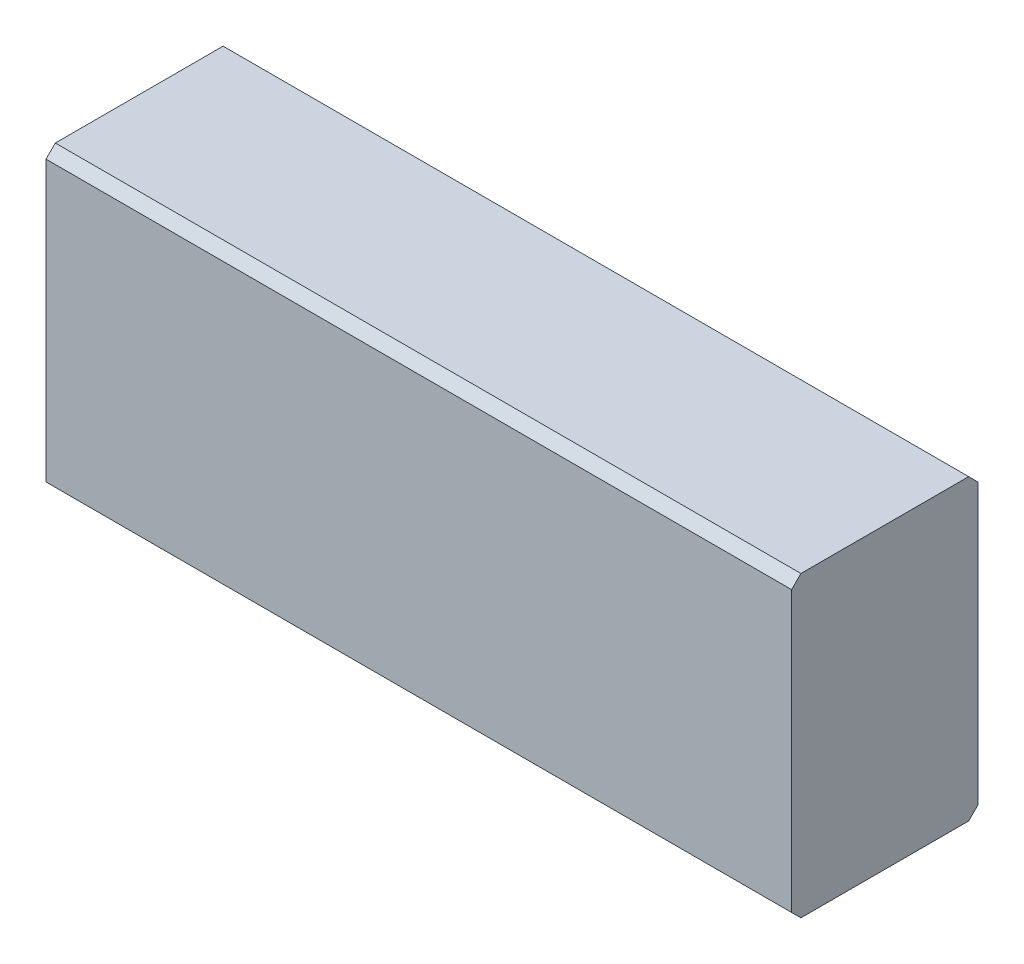
ISO-10303-21;
HEADER;
FILE_DESCRIPTION(('STEP AP214'),'2;1');
FILE_NAME('part.step','',(''),(''),'','','');
FILE_SCHEMA(('AUTOMOTIVE_DESIGN { 1 0 10303 214 1 1 1 1 }'));
ENDSEC;
DATA;
#1=APPLICATION_CONTEXT('core data for automotive mechanical design processes');
#2=APPLICATION_PROTOCOL_DEFINITION('international standard','automotive_design',2000,#1);
#3=PRODUCT_CONTEXT('',#1,'mechanical');
#4=PRODUCT('Part','Part','',(#3));
#5=PRODUCT_RELATED_PRODUCT_CATEGORY('part','',(#4));
#6=PRODUCT_DEFINITION_FORMATION('','',#4);
#7=PRODUCT_DEFINITION_CONTEXT('part definition',#1,'design');
#8=PRODUCT_DEFINITION('design','',#6,#7);
#9=PRODUCT_DEFINITION_SHAPE('','',#8);
#10=(LENGTH_UNIT() NAMED_UNIT(*) SI_UNIT(.MILLI.,.METRE.));
#11=(NAMED_UNIT(*) PLANE_ANGLE_UNIT() SI_UNIT($,.RADIAN.));
#12=(NAMED_UNIT(*) SI_UNIT($,.STERADIAN.) SOLID_ANGLE_UNIT());
#13=UNCERTAINTY_MEASURE_WITH_UNIT(LENGTH_MEASURE(1.E-05),#10,'distance_accuracy_value','');
#14=(GEOMETRIC_REPRESENTATION_CONTEXT(3) GLOBAL_UNCERTAINTY_ASSIGNED_CONTEXT((#13)) GLOBAL_UNIT_ASSIGNED_CONTEXT((#10,
#11,#12)) REPRESENTATION_CONTEXT('',''));
#15=CARTESIAN_POINT('',(0.,0.,0.));
#16=DIRECTION('',(0.,0.,1.));
#17=DIRECTION('',(1.,0.,0.));
#18=AXIS2_PLACEMENT_3D('',#15,#16,#17);
#19=CARTESIAN_POINT('',(4.,4.,5.));
#20=DIRECTION('',(-1.,0.,0.));
#21=DIRECTION('',(0.,-1.,0.));
#22=AXIS2_PLACEMENT_3D('',#19,#20,#21);
#23=PLANE('',#22);
#24=DIRECTION('',(0.,1.,0.));
#25=VECTOR('',#24,1.);
#26=CARTESIAN_POINT('',(4.,4.,0.));
#27=LINE('',#26,#25);
#28=CARTESIAN_POINT('',(4.,-3.75,0.));
#29=VERTEX_POINT('',#28);
#30=CARTESIAN_POINT('',(4.,3.75,0.));
#31=VERTEX_POINT('',#30);
#32=EDGE_CURVE('E191',#29,#31,#27,.T.);
#33=ORIENTED_EDGE('',*,*,#32,.T.);
#34=DIRECTION('',(0.,-0.707106781186548,-0.707106781186548));
#35=VECTOR('',#34,1.);
#36=CARTESIAN_POINT('',(4.,4.,0.25));
#37=LINE('',#36,#35);
#38=CARTESIAN_POINT('',(4.,4.,0.25));
#39=VERTEX_POINT('',#38);
#40=EDGE_CURVE('E171',#31,#39,#37,.F.);
#41=ORIENTED_EDGE('',*,*,#40,.T.);
#42=DIRECTION('',(0.,0.,-1.));
#43=VECTOR('',#42,1.);
#44=CARTESIAN_POINT('',(4.,4.,5.));
#45=LINE('',#44,#43);
#46=CARTESIAN_POINT('',(4.,4.,4.74999999999999));
#47=VERTEX_POINT('',#46);
#48=EDGE_CURVE('E135',#47,#39,#45,.T.);
#49=ORIENTED_EDGE('',*,*,#48,.F.);
#50=DIRECTION('',(0.,-0.707106781186543,0.707106781186552));
#51=VECTOR('',#50,1.);
#52=CARTESIAN_POINT('',(4.,3.75,5.));
#53=LINE('',#52,#51);
#54=CARTESIAN_POINT('',(4.,3.75,5.));
#55=VERTEX_POINT('',#54);
#56=EDGE_CURVE('E140',#47,#55,#53,.T.);
#57=ORIENTED_EDGE('',*,*,#56,.T.);
#58=DIRECTION('',(0.,1.,0.));
#59=VECTOR('',#58,1.);
#60=CARTESIAN_POINT('',(4.,4.,5.));
#61=LINE('',#60,#59);
#62=CARTESIAN_POINT('',(4.,-3.75,5.));
#63=VERTEX_POINT('',#62);
#64=EDGE_CURVE('E136',#63,#55,#61,.T.);
#65=ORIENTED_EDGE('',*,*,#64,.F.);
#66=DIRECTION('',(0.,-0.707106781186548,-0.707106781186548));
#67=VECTOR('',#66,1.);
#68=CARTESIAN_POINT('',(4.,-3.75,5.));
#69=LINE('',#68,#67);
#70=CARTESIAN_POINT('',(4.,-4.,4.75));
#71=VERTEX_POINT('',#70);
#72=EDGE_CURVE('E69',#63,#71,#69,.T.);
#73=ORIENTED_EDGE('',*,*,#72,.T.);
#74=DIRECTION('',(0.,0.,-1.));
#75=VECTOR('',#74,1.);
#76=CARTESIAN_POINT('',(4.,-4.,5.));
#77=LINE('',#76,#75);
#78=CARTESIAN_POINT('',(4.,-4.,0.25));
#79=VERTEX_POINT('',#78);
#80=EDGE_CURVE('E148',#71,#79,#77,.T.);
#81=ORIENTED_EDGE('',*,*,#80,.T.);
#82=DIRECTION('',(0.,-0.707106781186548,0.707106781186548));
#83=VECTOR('',#82,1.);
#84=CARTESIAN_POINT('',(4.,-4.,0.250000000000001));
#85=LINE('',#84,#83);
#86=EDGE_CURVE('E61',#79,#29,#85,.F.);
#87=ORIENTED_EDGE('',*,*,#86,.T.);
#88=EDGE_LOOP('',(#33,#41,#49,#57,#65,#73,#81,#87));
#89=FACE_BOUND('',#88,.T.);
#90=ADVANCED_FACE('F45',(#89),#23,.F.);
#91=CARTESIAN_POINT('',(0.,4.,5.));
#92=DIRECTION('',(0.,-1.,0.));
#93=DIRECTION('',(0.,0.,-1.));
#94=AXIS2_PLACEMENT_3D('',#91,#92,#93);
#95=PLANE('',#94);
#96=ORIENTED_EDGE('',*,*,#48,.T.);
#97=DIRECTION('',(-1.,0.,0.));
#98=VECTOR('',#97,1.);
#99=CARTESIAN_POINT('',(0.,4.,0.25));
#100=LINE('',#99,#98);
#101=CARTESIAN_POINT('',(-16.,4.,0.25));
#102=VERTEX_POINT('',#101);
#103=EDGE_CURVE('E133',#39,#102,#100,.T.);
#104=ORIENTED_EDGE('',*,*,#103,.T.);
#105=DIRECTION('',(0.,0.,-1.));
#106=VECTOR('',#105,1.);
#107=CARTESIAN_POINT('',(-16.,4.,5.));
#108=LINE('',#107,#106);
#109=CARTESIAN_POINT('',(-16.,4.,4.74999999999999));
#110=VERTEX_POINT('',#109);
#111=EDGE_CURVE('E116',#110,#102,#108,.T.);
#112=ORIENTED_EDGE('',*,*,#111,.F.);
#113=DIRECTION('',(1.,0.,0.));
#114=VECTOR('',#113,1.);
#115=CARTESIAN_POINT('',(4.,4.,4.74999999999999));
#116=LINE('',#115,#114);
#117=EDGE_CURVE('E130',#110,#47,#116,.T.);
#118=ORIENTED_EDGE('',*,*,#117,.T.);
#119=EDGE_LOOP('',(#96,#104,#112,#118));
#120=FACE_BOUND('',#119,.T.);
#121=ADVANCED_FACE('F129',(#120),#95,.F.);
#122=CARTESIAN_POINT('',(-12.,-4.,5.));
#123=DIRECTION('',(0.,1.,0.));
#124=DIRECTION('',(0.,0.,1.));
#125=AXIS2_PLACEMENT_3D('',#122,#123,#124);
#126=PLANE('',#125);
#127=DIRECTION('',(0.,0.,-1.));
#128=VECTOR('',#127,1.);
#129=CARTESIAN_POINT('',(-16.,-4.,5.));
#130=LINE('',#129,#128);
#131=CARTESIAN_POINT('',(-16.,-4.,4.75));
#132=VERTEX_POINT('',#131);
#133=CARTESIAN_POINT('',(-16.,-4.,0.25));
#134=VERTEX_POINT('',#133);
#135=EDGE_CURVE('E142',#132,#134,#130,.T.);
#136=ORIENTED_EDGE('',*,*,#135,.T.);
#137=DIRECTION('',(1.,0.,0.));
#138=VECTOR('',#137,1.);
#139=CARTESIAN_POINT('',(-12.,-4.,0.25));
#140=LINE('',#139,#138);
#141=EDGE_CURVE('E177',#134,#79,#140,.T.);
#142=ORIENTED_EDGE('',*,*,#141,.T.);
#143=ORIENTED_EDGE('',*,*,#80,.F.);
#144=DIRECTION('',(-1.,0.,0.));
#145=VECTOR('',#144,1.);
#146=CARTESIAN_POINT('',(-16.,-4.,4.75));
#147=LINE('',#146,#145);
#148=EDGE_CURVE('E174',#71,#132,#147,.T.);
#149=ORIENTED_EDGE('',*,*,#148,.T.);
#150=EDGE_LOOP('',(#136,#142,#143,#149));
#151=FACE_BOUND('',#150,.T.);
#152=ADVANCED_FACE('F205',(#151),#126,.F.);
#153=CARTESIAN_POINT('',(0.,0.,5.));
#154=DIRECTION('',(0.,0.,1.));
#155=DIRECTION('',(1.,0.,0.));
#156=AXIS2_PLACEMENT_3D('',#153,#154,#155);
#157=PLANE('',#156);
#158=ORIENTED_EDGE('',*,*,#64,.T.);
#159=DIRECTION('',(-1.,0.,0.));
#160=VECTOR('',#159,1.);
#161=CARTESIAN_POINT('',(-16.,3.75,5.));
#162=LINE('',#161,#160);
#163=CARTESIAN_POINT('',(-16.,3.75,5.));
#164=VERTEX_POINT('',#163);
#165=EDGE_CURVE('E11',#55,#164,#162,.T.);
#166=ORIENTED_EDGE('',*,*,#165,.T.);
#167=DIRECTION('',(0.,-1.,0.));
#168=VECTOR('',#167,1.);
#169=CARTESIAN_POINT('',(-16.,4.,5.));
#170=LINE('',#169,#168);
#171=CARTESIAN_POINT('',(-16.,-3.75,5.));
#172=VERTEX_POINT('',#171);
#173=EDGE_CURVE('E118',#164,#172,#170,.T.);
#174=ORIENTED_EDGE('',*,*,#173,.T.);
#175=DIRECTION('',(1.,0.,0.));
#176=VECTOR('',#175,1.);
#177=CARTESIAN_POINT('',(4.,-3.75,5.));
#178=LINE('',#177,#176);
#179=EDGE_CURVE('E54',#172,#63,#178,.T.);
#180=ORIENTED_EDGE('',*,*,#179,.T.);
#181=EDGE_LOOP('',(#158,#166,#174,#180));
#182=FACE_BOUND('',#181,.T.);
#183=ADVANCED_FACE('F184',(#182),#157,.T.);
#184=CARTESIAN_POINT('',(0.,0.,0.));
#185=DIRECTION('',(0.,0.,1.));
#186=DIRECTION('',(1.,0.,0.));
#187=AXIS2_PLACEMENT_3D('',#184,#185,#186);
#188=PLANE('',#187);
#189=DIRECTION('',(0.,-1.,0.));
#190=VECTOR('',#189,1.);
#191=CARTESIAN_POINT('',(-16.,4.,0.));
#192=LINE('',#191,#190);
#193=CARTESIAN_POINT('',(-16.,3.75,0.));
#194=VERTEX_POINT('',#193);
#195=CARTESIAN_POINT('',(-16.,-3.75,0.));
#196=VERTEX_POINT('',#195);
#197=EDGE_CURVE('E194',#194,#196,#192,.T.);
#198=ORIENTED_EDGE('',*,*,#197,.F.);
#199=DIRECTION('',(1.,0.,0.));
#200=VECTOR('',#199,1.);
#201=CARTESIAN_POINT('',(0.,3.75,0.));
#202=LINE('',#201,#200);
#203=EDGE_CURVE('E162',#194,#31,#202,.T.);
#204=ORIENTED_EDGE('',*,*,#203,.T.);
#205=ORIENTED_EDGE('',*,*,#32,.F.);
#206=DIRECTION('',(-1.,0.,0.));
#207=VECTOR('',#206,1.);
#208=CARTESIAN_POINT('',(0.,-3.75,0.));
#209=LINE('',#208,#207);
#210=EDGE_CURVE('E159',#29,#196,#209,.T.);
#211=ORIENTED_EDGE('',*,*,#210,.T.);
#212=EDGE_LOOP('',(#198,#204,#205,#211));
#213=FACE_BOUND('',#212,.T.);
#214=ADVANCED_FACE('F211',(#213),#188,.F.);
#215=CARTESIAN_POINT('',(-16.,4.,5.));
#216=DIRECTION('',(1.,0.,0.));
#217=DIRECTION('',(0.,0.,-1.));
#218=AXIS2_PLACEMENT_3D('',#215,#216,#217);
#219=PLANE('',#218);
#220=ORIENTED_EDGE('',*,*,#111,.T.);
#221=DIRECTION('',(0.,0.707106781186548,0.707106781186548));
#222=VECTOR('',#221,1.);
#223=CARTESIAN_POINT('',(-16.,4.,0.25));
#224=LINE('',#223,#222);
#225=EDGE_CURVE('E156',#102,#194,#224,.F.);
#226=ORIENTED_EDGE('',*,*,#225,.T.);
#227=ORIENTED_EDGE('',*,*,#197,.T.);
#228=DIRECTION('',(0.,0.707106781186548,-0.707106781186548));
#229=VECTOR('',#228,1.);
#230=CARTESIAN_POINT('',(-16.,-4.,0.25));
#231=LINE('',#230,#229);
#232=EDGE_CURVE('E123',#196,#134,#231,.F.);
#233=ORIENTED_EDGE('',*,*,#232,.T.);
#234=ORIENTED_EDGE('',*,*,#135,.F.);
#235=DIRECTION('',(0.,0.707106781186548,0.707106781186548));
#236=VECTOR('',#235,1.);
#237=CARTESIAN_POINT('',(-16.,-3.75,5.));
#238=LINE('',#237,#236);
#239=EDGE_CURVE('E124',#132,#172,#238,.T.);
#240=ORIENTED_EDGE('',*,*,#239,.T.);
#241=ORIENTED_EDGE('',*,*,#173,.F.);
#242=DIRECTION('',(0.,0.707106781186543,-0.707106781186552));
#243=VECTOR('',#242,1.);
#244=CARTESIAN_POINT('',(-16.,3.75,5.));
#245=LINE('',#244,#243);
#246=EDGE_CURVE('E113',#164,#110,#245,.T.);
#247=ORIENTED_EDGE('',*,*,#246,.T.);
#248=EDGE_LOOP('',(#220,#226,#227,#233,#234,#240,#241,#247));
#249=FACE_BOUND('',#248,.T.);
#250=ADVANCED_FACE('F115',(#249),#219,.F.);
#251=CARTESIAN_POINT('',(0.,4.,0.25));
#252=DIRECTION('',(0.,-0.707106781186547,0.707106781186547));
#253=DIRECTION('',(0.,-0.707106781186548,-0.707106781186548));
#254=AXIS2_PLACEMENT_3D('',#251,#252,#253);
#255=PLANE('',#254);
#256=ORIENTED_EDGE('',*,*,#40,.F.);
#257=ORIENTED_EDGE('',*,*,#203,.F.);
#258=ORIENTED_EDGE('',*,*,#225,.F.);
#259=ORIENTED_EDGE('',*,*,#103,.F.);
#260=EDGE_LOOP('',(#256,#257,#258,#259));
#261=FACE_BOUND('',#260,.T.);
#262=ADVANCED_FACE('F215',(#261),#255,.F.);
#263=CARTESIAN_POINT('',(-12.,-4.,0.25));
#264=DIRECTION('',(0.,0.707106781186547,0.707106781186547));
#265=DIRECTION('',(0.,-0.707106781186548,0.707106781186548));
#266=AXIS2_PLACEMENT_3D('',#263,#264,#265);
#267=PLANE('',#266);
#268=ORIENTED_EDGE('',*,*,#232,.F.);
#269=ORIENTED_EDGE('',*,*,#210,.F.);
#270=ORIENTED_EDGE('',*,*,#86,.F.);
#271=ORIENTED_EDGE('',*,*,#141,.F.);
#272=EDGE_LOOP('',(#268,#269,#270,#271));
#273=FACE_BOUND('',#272,.T.);
#274=ADVANCED_FACE('F208',(#273),#267,.F.);
#275=CARTESIAN_POINT('',(0.,3.75,5.));
#276=DIRECTION('',(0.,0.707106781186552,0.707106781186543));
#277=DIRECTION('',(0.,-0.707106781186543,0.707106781186552));
#278=AXIS2_PLACEMENT_3D('',#275,#276,#277);
#279=PLANE('',#278);
#280=ORIENTED_EDGE('',*,*,#56,.F.);
#281=ORIENTED_EDGE('',*,*,#117,.F.);
#282=ORIENTED_EDGE('',*,*,#246,.F.);
#283=ORIENTED_EDGE('',*,*,#165,.F.);
#284=EDGE_LOOP('',(#280,#281,#282,#283));
#285=FACE_BOUND('',#284,.T.);
#286=ADVANCED_FACE('F139',(#285),#279,.T.);
#287=CARTESIAN_POINT('',(0.,-3.75,5.));
#288=DIRECTION('',(0.,-0.707106781186547,0.707106781186547));
#289=DIRECTION('',(0.,-0.707106781186548,-0.707106781186548));
#290=AXIS2_PLACEMENT_3D('',#287,#288,#289);
#291=PLANE('',#290);
#292=ORIENTED_EDGE('',*,*,#239,.F.);
#293=ORIENTED_EDGE('',*,*,#148,.F.);
#294=ORIENTED_EDGE('',*,*,#72,.F.);
#295=ORIENTED_EDGE('',*,*,#179,.F.);
#296=EDGE_LOOP('',(#292,#293,#294,#295));
#297=FACE_BOUND('',#296,.T.);
#298=ADVANCED_FACE('F47',(#297),#291,.T.);
#299=CLOSED_SHELL('',(#90,#121,#152,#183,#214,#250,#262,#274,#286,#298));
#300=MANIFOLD_SOLID_BREP('B2',#299);
#301=ADVANCED_BREP_SHAPE_REPRESENTATION('',(#18,#300),#14);
#302=SHAPE_DEFINITION_REPRESENTATION(#9,#301);
ENDSEC;
END-ISO-10303-21;
